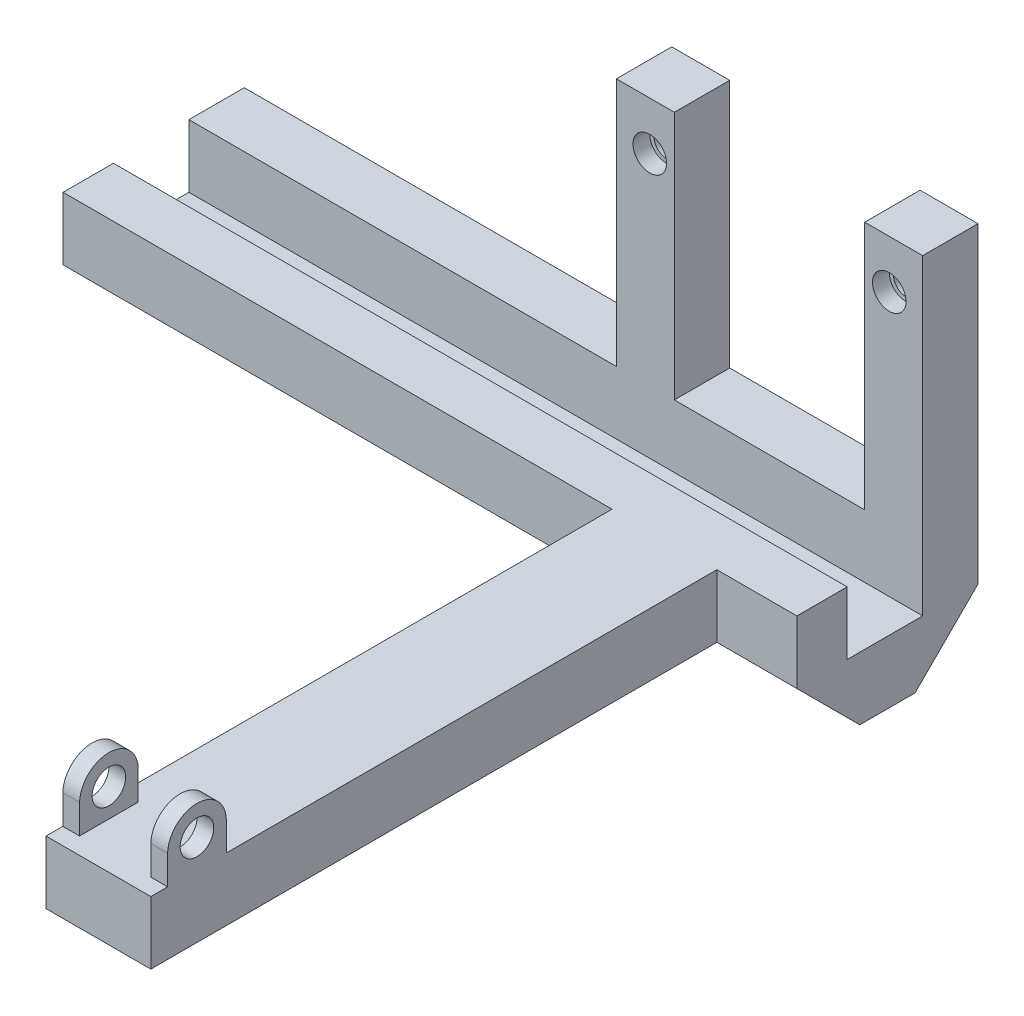
ISO-10303-21;
HEADER;
FILE_DESCRIPTION(('STEP AP214'),'2;1');
FILE_NAME('part.step','',(''),(''),'','','');
FILE_SCHEMA(('AUTOMOTIVE_DESIGN { 1 0 10303 214 1 1 1 1 }'));
ENDSEC;
DATA;
#1=APPLICATION_CONTEXT('core data for automotive mechanical design processes');
#2=APPLICATION_PROTOCOL_DEFINITION('international standard','automotive_design',2000,#1);
#3=PRODUCT_CONTEXT('',#1,'mechanical');
#4=PRODUCT('Part','Part','',(#3));
#5=PRODUCT_RELATED_PRODUCT_CATEGORY('part','',(#4));
#6=PRODUCT_DEFINITION_FORMATION('','',#4);
#7=PRODUCT_DEFINITION_CONTEXT('part definition',#1,'design');
#8=PRODUCT_DEFINITION('design','',#6,#7);
#9=PRODUCT_DEFINITION_SHAPE('','',#8);
#10=(LENGTH_UNIT() NAMED_UNIT(*) SI_UNIT(.MILLI.,.METRE.));
#11=(NAMED_UNIT(*) PLANE_ANGLE_UNIT() SI_UNIT($,.RADIAN.));
#12=(NAMED_UNIT(*) SI_UNIT($,.STERADIAN.) SOLID_ANGLE_UNIT());
#13=UNCERTAINTY_MEASURE_WITH_UNIT(LENGTH_MEASURE(1.E-05),#10,'distance_accuracy_value','');
#14=(GEOMETRIC_REPRESENTATION_CONTEXT(3) GLOBAL_UNCERTAINTY_ASSIGNED_CONTEXT((#13)) GLOBAL_UNIT_ASSIGNED_CONTEXT((#10,
#11,#12)) REPRESENTATION_CONTEXT('',''));
#15=CARTESIAN_POINT('',(0.,0.,0.));
#16=DIRECTION('',(0.,0.,1.));
#17=DIRECTION('',(1.,0.,0.));
#18=AXIS2_PLACEMENT_3D('',#15,#16,#17);
#19=CARTESIAN_POINT('',(-3.98,12.40971438,-8.80000000000001));
#20=DIRECTION('',(0.,0.,1.));
#21=DIRECTION('',(1.,0.,0.));
#22=AXIS2_PLACEMENT_3D('',#19,#20,#21);
#23=CYLINDRICAL_SURFACE('',#22,1.5);
#24=CARTESIAN_POINT('',(-3.98,12.40971438,8.4));
#25=DIRECTION('',(0.,0.,1.));
#26=DIRECTION('',(0.,-1.,0.));
#27=AXIS2_PLACEMENT_3D('',#24,#25,#26);
#28=CIRCLE('',#27,1.5);
#29=CARTESIAN_POINT('',(-3.98,10.90971438,8.4));
#30=VERTEX_POINT('',#29);
#31=EDGE_CURVE('E357',#30,#30,#28,.T.);
#32=ORIENTED_EDGE('',*,*,#31,.F.);
#33=EDGE_LOOP('',(#32));
#34=FACE_BOUND('',#33,.T.);
#35=CARTESIAN_POINT('',(-3.98,12.40971438,13.));
#36=DIRECTION('',(0.,0.,1.));
#37=DIRECTION('',(1.,0.,0.));
#38=AXIS2_PLACEMENT_3D('',#35,#36,#37);
#39=CIRCLE('',#38,1.5);
#40=CARTESIAN_POINT('',(-2.48,12.40971438,13.));
#41=VERTEX_POINT('',#40);
#42=EDGE_CURVE('E43',#41,#41,#39,.F.);
#43=ORIENTED_EDGE('',*,*,#42,.F.);
#44=EDGE_LOOP('',(#43));
#45=FACE_BOUND('',#44,.T.);
#46=ADVANCED_FACE('F39',(#34,#45),#23,.F.);
#47=CARTESIAN_POINT('',(-32.54,12.40971438,-8.80000000000001));
#48=DIRECTION('',(0.,0.,1.));
#49=DIRECTION('',(1.,0.,0.));
#50=AXIS2_PLACEMENT_3D('',#47,#48,#49);
#51=CYLINDRICAL_SURFACE('',#50,1.5);
#52=CARTESIAN_POINT('',(-32.54,12.40971438,8.4));
#53=DIRECTION('',(0.,0.,1.));
#54=DIRECTION('',(0.,-1.,0.));
#55=AXIS2_PLACEMENT_3D('',#52,#53,#54);
#56=CIRCLE('',#55,1.5);
#57=CARTESIAN_POINT('',(-32.54,10.90971438,8.4));
#58=VERTEX_POINT('',#57);
#59=EDGE_CURVE('E377',#58,#58,#56,.T.);
#60=ORIENTED_EDGE('',*,*,#59,.F.);
#61=EDGE_LOOP('',(#60));
#62=FACE_BOUND('',#61,.T.);
#63=CARTESIAN_POINT('',(-32.54,12.40971438,13.));
#64=DIRECTION('',(0.,0.,1.));
#65=DIRECTION('',(1.,0.,0.));
#66=AXIS2_PLACEMENT_3D('',#63,#64,#65);
#67=CIRCLE('',#66,1.5);
#68=CARTESIAN_POINT('',(-31.04,12.40971438,13.));
#69=VERTEX_POINT('',#68);
#70=EDGE_CURVE('E348',#69,#69,#67,.F.);
#71=ORIENTED_EDGE('',*,*,#70,.F.);
#72=EDGE_LOOP('',(#71));
#73=FACE_BOUND('',#72,.T.);
#74=ADVANCED_FACE('F695',(#62,#73),#51,.F.);
#75=CARTESIAN_POINT('',(-22.04,-11.56,-15.402));
#76=DIRECTION('',(-1.,0.,0.));
#77=DIRECTION('',(0.,-1.,0.));
#78=AXIS2_PLACEMENT_3D('',#75,#76,#77);
#79=PLANE('',#78);
#80=CARTESIAN_POINT('',(-22.04,-8.1939412358239,92.));
#81=DIRECTION('',(-1.,0.,0.));
#82=DIRECTION('',(0.,-1.,0.));
#83=AXIS2_PLACEMENT_3D('',#80,#81,#82);
#84=CIRCLE('',#83,2.);
#85=CARTESIAN_POINT('',(-22.04,-10.1939412358239,92.));
#86=VERTEX_POINT('',#85);
#87=EDGE_CURVE('E456',#86,#86,#84,.T.);
#88=ORIENTED_EDGE('',*,*,#87,.F.);
#89=EDGE_LOOP('',(#88));
#90=FACE_BOUND('',#89,.T.);
#91=CARTESIAN_POINT('',(-22.04,-8.1939412358239,92.));
#92=DIRECTION('',(-1.,0.,0.));
#93=DIRECTION('',(0.,-1.,0.));
#94=AXIS2_PLACEMENT_3D('',#91,#92,#93);
#95=CIRCLE('',#94,3.50192370515723);
#96=CARTESIAN_POINT('',(-22.04,-8.07788247164778,88.5));
#97=VERTEX_POINT('',#96);
#98=CARTESIAN_POINT('',(-22.04,-8.07788247164778,95.5));
#99=VERTEX_POINT('',#98);
#100=EDGE_CURVE('E57',#97,#99,#95,.F.);
#101=ORIENTED_EDGE('',*,*,#100,.F.);
#102=DIRECTION('',(0.,-1.,0.));
#103=VECTOR('',#102,1.);
#104=CARTESIAN_POINT('',(-22.04,-1.56000000000001,88.5));
#105=LINE('',#104,#103);
#106=CARTESIAN_POINT('',(-22.04,-11.56,88.5));
#107=VERTEX_POINT('',#106);
#108=EDGE_CURVE('E516',#97,#107,#105,.T.);
#109=ORIENTED_EDGE('',*,*,#108,.T.);
#110=DIRECTION('',(0.,0.,1.));
#111=VECTOR('',#110,1.);
#112=CARTESIAN_POINT('',(-22.04,-11.56,-15.402));
#113=LINE('',#112,#111);
#114=CARTESIAN_POINT('',(-22.04,-11.56,30.));
#115=VERTEX_POINT('',#114);
#116=EDGE_CURVE('E289',#115,#107,#113,.T.);
#117=ORIENTED_EDGE('',*,*,#116,.F.);
#118=DIRECTION('',(0.,-1.,0.));
#119=VECTOR('',#118,1.);
#120=CARTESIAN_POINT('',(-22.04,-11.56,30.));
#121=LINE('',#120,#119);
#122=CARTESIAN_POINT('',(-22.04,-19.06,30.));
#123=VERTEX_POINT('',#122);
#124=EDGE_CURVE('E279',#115,#123,#121,.T.);
#125=ORIENTED_EDGE('',*,*,#124,.T.);
#126=DIRECTION('',(0.,0.,-1.));
#127=VECTOR('',#126,1.);
#128=CARTESIAN_POINT('',(-22.04,-19.06,30.));
#129=LINE('',#128,#127);
#130=CARTESIAN_POINT('',(-22.04,-19.06,97.5));
#131=VERTEX_POINT('',#130);
#132=EDGE_CURVE('E546',#131,#123,#129,.T.);
#133=ORIENTED_EDGE('',*,*,#132,.F.);
#134=DIRECTION('',(0.,-1.,0.));
#135=VECTOR('',#134,1.);
#136=CARTESIAN_POINT('',(-22.04,-11.56,97.5));
#137=LINE('',#136,#135);
#138=CARTESIAN_POINT('',(-22.04,-11.56,97.5));
#139=VERTEX_POINT('',#138);
#140=EDGE_CURVE('E284',#139,#131,#137,.T.);
#141=ORIENTED_EDGE('',*,*,#140,.F.);
#142=CARTESIAN_POINT('',(-22.04,-11.56,95.5));
#143=VERTEX_POINT('',#142);
#144=EDGE_CURVE('E283',#143,#139,#113,.T.);
#145=ORIENTED_EDGE('',*,*,#144,.F.);
#146=DIRECTION('',(0.,-1.,0.));
#147=VECTOR('',#146,1.);
#148=CARTESIAN_POINT('',(-22.04,-1.56000000000001,95.5));
#149=LINE('',#148,#147);
#150=EDGE_CURVE('E525',#99,#143,#149,.T.);
#151=ORIENTED_EDGE('',*,*,#150,.F.);
#152=EDGE_LOOP('',(#101,#109,#117,#125,#133,#141,#145,#151));
#153=FACE_BOUND('',#152,.T.);
#154=ADVANCED_FACE('F595',(#90,#153),#79,.T.);
#155=CARTESIAN_POINT('',(-9.54,-11.56,30.));
#156=DIRECTION('',(-1.,0.,0.));
#157=DIRECTION('',(0.,-1.,0.));
#158=AXIS2_PLACEMENT_3D('',#155,#156,#157);
#159=PLANE('',#158);
#160=CARTESIAN_POINT('',(-9.54,-8.1939412358239,92.));
#161=DIRECTION('',(1.,0.,0.));
#162=DIRECTION('',(0.,1.,0.));
#163=AXIS2_PLACEMENT_3D('',#160,#161,#162);
#164=CIRCLE('',#163,2.);
#165=CARTESIAN_POINT('',(-9.54,-6.1939412358239,92.));
#166=VERTEX_POINT('',#165);
#167=EDGE_CURVE('E347',#166,#166,#164,.T.);
#168=ORIENTED_EDGE('',*,*,#167,.F.);
#169=EDGE_LOOP('',(#168));
#170=FACE_BOUND('',#169,.T.);
#171=DIRECTION('',(0.,-1.,0.));
#172=VECTOR('',#171,1.);
#173=CARTESIAN_POINT('',(-9.54,-1.56000000000001,88.5));
#174=LINE('',#173,#172);
#175=CARTESIAN_POINT('',(-9.54,-8.07788247164778,88.5));
#176=VERTEX_POINT('',#175);
#177=CARTESIAN_POINT('',(-9.54,-11.56,88.5));
#178=VERTEX_POINT('',#177);
#179=EDGE_CURVE('E501',#176,#178,#174,.T.);
#180=ORIENTED_EDGE('',*,*,#179,.F.);
#181=CARTESIAN_POINT('',(-9.54,-8.1939412358239,92.));
#182=DIRECTION('',(1.,0.,0.));
#183=DIRECTION('',(0.,1.,0.));
#184=AXIS2_PLACEMENT_3D('',#181,#182,#183);
#185=CIRCLE('',#184,3.50192370515723);
#186=CARTESIAN_POINT('',(-9.54,-8.07788247164778,95.5));
#187=VERTEX_POINT('',#186);
#188=EDGE_CURVE('E460',#187,#176,#185,.F.);
#189=ORIENTED_EDGE('',*,*,#188,.F.);
#190=DIRECTION('',(0.,-1.,0.));
#191=VECTOR('',#190,1.);
#192=CARTESIAN_POINT('',(-9.54,-1.56000000000001,95.5));
#193=LINE('',#192,#191);
#194=CARTESIAN_POINT('',(-9.54,-11.56,95.5));
#195=VERTEX_POINT('',#194);
#196=EDGE_CURVE('E492',#187,#195,#193,.T.);
#197=ORIENTED_EDGE('',*,*,#196,.T.);
#198=DIRECTION('',(0.,0.,1.));
#199=VECTOR('',#198,1.);
#200=CARTESIAN_POINT('',(-9.54,-11.56,30.));
#201=LINE('',#200,#199);
#202=CARTESIAN_POINT('',(-9.54,-11.56,97.5));
#203=VERTEX_POINT('',#202);
#204=EDGE_CURVE('E271',#195,#203,#201,.T.);
#205=ORIENTED_EDGE('',*,*,#204,.T.);
#206=DIRECTION('',(0.,-1.,0.));
#207=VECTOR('',#206,1.);
#208=CARTESIAN_POINT('',(-9.54,-11.56,97.5));
#209=LINE('',#208,#207);
#210=CARTESIAN_POINT('',(-9.54,-19.06,97.5));
#211=VERTEX_POINT('',#210);
#212=EDGE_CURVE('E266',#203,#211,#209,.T.);
#213=ORIENTED_EDGE('',*,*,#212,.T.);
#214=DIRECTION('',(0.,0.,-1.));
#215=VECTOR('',#214,1.);
#216=CARTESIAN_POINT('',(-9.54,-19.06,30.));
#217=LINE('',#216,#215);
#218=CARTESIAN_POINT('',(-9.54,-19.06,30.));
#219=VERTEX_POINT('',#218);
#220=EDGE_CURVE('E11',#211,#219,#217,.T.);
#221=ORIENTED_EDGE('',*,*,#220,.T.);
#222=DIRECTION('',(0.,-1.,0.));
#223=VECTOR('',#222,1.);
#224=CARTESIAN_POINT('',(-9.54,-11.56,30.));
#225=LINE('',#224,#223);
#226=CARTESIAN_POINT('',(-9.54,-11.56,30.));
#227=VERTEX_POINT('',#226);
#228=EDGE_CURVE('E267',#227,#219,#225,.T.);
#229=ORIENTED_EDGE('',*,*,#228,.F.);
#230=EDGE_CURVE('E275',#227,#178,#201,.T.);
#231=ORIENTED_EDGE('',*,*,#230,.T.);
#232=EDGE_LOOP('',(#180,#189,#197,#205,#213,#221,#229,#231));
#233=FACE_BOUND('',#232,.T.);
#234=ADVANCED_FACE('F604',(#170,#233),#159,.F.);
#235=CARTESIAN_POINT('',(-20.04,-1.56000000000001,95.5));
#236=DIRECTION('',(-1.,0.,0.));
#237=DIRECTION('',(0.,0.,1.));
#238=AXIS2_PLACEMENT_3D('',#235,#236,#237);
#239=PLANE('',#238);
#240=CARTESIAN_POINT('',(-20.04,-8.1939412358239,92.));
#241=DIRECTION('',(-1.,0.,0.));
#242=DIRECTION('',(0.,0.,1.));
#243=AXIS2_PLACEMENT_3D('',#240,#241,#242);
#244=CIRCLE('',#243,2.);
#245=CARTESIAN_POINT('',(-20.04,-8.1939412358239,94.));
#246=VERTEX_POINT('',#245);
#247=EDGE_CURVE('E346',#246,#246,#244,.T.);
#248=ORIENTED_EDGE('',*,*,#247,.T.);
#249=EDGE_LOOP('',(#248));
#250=FACE_BOUND('',#249,.T.);
#251=DIRECTION('',(0.,-1.,0.));
#252=VECTOR('',#251,1.);
#253=CARTESIAN_POINT('',(-20.04,-1.56000000000001,88.5));
#254=LINE('',#253,#252);
#255=CARTESIAN_POINT('',(-20.04,-8.07788247164778,88.5));
#256=VERTEX_POINT('',#255);
#257=CARTESIAN_POINT('',(-20.04,-11.56,88.5));
#258=VERTEX_POINT('',#257);
#259=EDGE_CURVE('E519',#256,#258,#254,.T.);
#260=ORIENTED_EDGE('',*,*,#259,.F.);
#261=CARTESIAN_POINT('',(-20.04,-8.1939412358239,92.));
#262=DIRECTION('',(-1.,0.,0.));
#263=DIRECTION('',(0.,0.,1.));
#264=AXIS2_PLACEMENT_3D('',#261,#262,#263);
#265=CIRCLE('',#264,3.50192370515723);
#266=CARTESIAN_POINT('',(-20.04,-8.07788247164778,95.5));
#267=VERTEX_POINT('',#266);
#268=EDGE_CURVE('E474',#256,#267,#265,.F.);
#269=ORIENTED_EDGE('',*,*,#268,.T.);
#270=DIRECTION('',(0.,-1.,0.));
#271=VECTOR('',#270,1.);
#272=CARTESIAN_POINT('',(-20.04,-1.56000000000001,95.5));
#273=LINE('',#272,#271);
#274=CARTESIAN_POINT('',(-20.04,-11.56,95.5));
#275=VERTEX_POINT('',#274);
#276=EDGE_CURVE('E522',#267,#275,#273,.T.);
#277=ORIENTED_EDGE('',*,*,#276,.T.);
#278=DIRECTION('',(0.,0.,-1.));
#279=VECTOR('',#278,1.);
#280=CARTESIAN_POINT('',(-20.04,-11.56,95.5));
#281=LINE('',#280,#279);
#282=EDGE_CURVE('E508',#275,#258,#281,.T.);
#283=ORIENTED_EDGE('',*,*,#282,.T.);
#284=EDGE_LOOP('',(#260,#269,#277,#283));
#285=FACE_BOUND('',#284,.T.);
#286=ADVANCED_FACE('F581',(#250,#285),#239,.F.);
#287=CARTESIAN_POINT('',(-11.54,-1.56000000000001,95.5));
#288=DIRECTION('',(1.,0.,0.));
#289=DIRECTION('',(0.,0.,-1.));
#290=AXIS2_PLACEMENT_3D('',#287,#288,#289);
#291=PLANE('',#290);
#292=CARTESIAN_POINT('',(-11.54,-8.1939412358239,92.));
#293=DIRECTION('',(1.,0.,0.));
#294=DIRECTION('',(0.,0.,-1.));
#295=AXIS2_PLACEMENT_3D('',#292,#293,#294);
#296=CIRCLE('',#295,2.);
#297=CARTESIAN_POINT('',(-11.54,-8.1939412358239,90.));
#298=VERTEX_POINT('',#297);
#299=EDGE_CURVE('E343',#298,#298,#296,.T.);
#300=ORIENTED_EDGE('',*,*,#299,.T.);
#301=EDGE_LOOP('',(#300));
#302=FACE_BOUND('',#301,.T.);
#303=DIRECTION('',(0.,-1.,0.));
#304=VECTOR('',#303,1.);
#305=CARTESIAN_POINT('',(-11.54,-1.56000000000001,95.5));
#306=LINE('',#305,#304);
#307=CARTESIAN_POINT('',(-11.54,-8.07788247164778,95.5));
#308=VERTEX_POINT('',#307);
#309=CARTESIAN_POINT('',(-11.54,-11.56,95.5));
#310=VERTEX_POINT('',#309);
#311=EDGE_CURVE('E495',#308,#310,#306,.T.);
#312=ORIENTED_EDGE('',*,*,#311,.F.);
#313=CARTESIAN_POINT('',(-11.54,-8.1939412358239,92.));
#314=DIRECTION('',(1.,0.,0.));
#315=DIRECTION('',(0.,0.,-1.));
#316=AXIS2_PLACEMENT_3D('',#313,#314,#315);
#317=CIRCLE('',#316,3.50192370515723);
#318=CARTESIAN_POINT('',(-11.54,-8.07788247164778,88.5));
#319=VERTEX_POINT('',#318);
#320=EDGE_CURVE('E65',#308,#319,#317,.F.);
#321=ORIENTED_EDGE('',*,*,#320,.T.);
#322=DIRECTION('',(0.,-1.,0.));
#323=VECTOR('',#322,1.);
#324=CARTESIAN_POINT('',(-11.54,-1.56000000000001,88.5));
#325=LINE('',#324,#323);
#326=CARTESIAN_POINT('',(-11.54,-11.56,88.5));
#327=VERTEX_POINT('',#326);
#328=EDGE_CURVE('E498',#319,#327,#325,.T.);
#329=ORIENTED_EDGE('',*,*,#328,.T.);
#330=DIRECTION('',(0.,0.,1.));
#331=VECTOR('',#330,1.);
#332=CARTESIAN_POINT('',(-11.54,-11.56,95.5));
#333=LINE('',#332,#331);
#334=EDGE_CURVE('E484',#327,#310,#333,.T.);
#335=ORIENTED_EDGE('',*,*,#334,.T.);
#336=EDGE_LOOP('',(#312,#321,#329,#335));
#337=FACE_BOUND('',#336,.T.);
#338=ADVANCED_FACE('F682',(#302,#337),#291,.F.);
#339=CARTESIAN_POINT('',(-22.04,-1.56000000000001,88.5));
#340=DIRECTION('',(0.,0.,1.));
#341=DIRECTION('',(1.,0.,0.));
#342=AXIS2_PLACEMENT_3D('',#339,#340,#341);
#343=PLANE('',#342);
#344=ORIENTED_EDGE('',*,*,#108,.F.);
#345=DIRECTION('',(1.,0.,0.));
#346=VECTOR('',#345,1.);
#347=CARTESIAN_POINT('',(-69.999860538626,-8.07788247164779,88.5));
#348=LINE('',#347,#346);
#349=EDGE_CURVE('E468',#97,#256,#348,.T.);
#350=ORIENTED_EDGE('',*,*,#349,.T.);
#351=ORIENTED_EDGE('',*,*,#259,.T.);
#352=DIRECTION('',(-1.,0.,0.));
#353=VECTOR('',#352,1.);
#354=CARTESIAN_POINT('',(-22.04,-11.56,88.5));
#355=LINE('',#354,#353);
#356=EDGE_CURVE('E512',#258,#107,#355,.T.);
#357=ORIENTED_EDGE('',*,*,#356,.T.);
#358=EDGE_LOOP('',(#344,#350,#351,#357));
#359=FACE_BOUND('',#358,.T.);
#360=ADVANCED_FACE('F593',(#359),#343,.F.);
#361=CARTESIAN_POINT('',(-9.54,-1.56000000000001,88.5));
#362=DIRECTION('',(0.,0.,1.));
#363=DIRECTION('',(1.,0.,0.));
#364=AXIS2_PLACEMENT_3D('',#361,#362,#363);
#365=PLANE('',#364);
#366=ORIENTED_EDGE('',*,*,#328,.F.);
#367=EDGE_CURVE('E464',#319,#176,#348,.T.);
#368=ORIENTED_EDGE('',*,*,#367,.T.);
#369=ORIENTED_EDGE('',*,*,#179,.T.);
#370=DIRECTION('',(-1.,0.,0.));
#371=VECTOR('',#370,1.);
#372=CARTESIAN_POINT('',(-9.54,-11.56,88.5));
#373=LINE('',#372,#371);
#374=EDGE_CURVE('E480',#178,#327,#373,.T.);
#375=ORIENTED_EDGE('',*,*,#374,.T.);
#376=EDGE_LOOP('',(#366,#368,#369,#375));
#377=FACE_BOUND('',#376,.T.);
#378=ADVANCED_FACE('F678',(#377),#365,.F.);
#379=CARTESIAN_POINT('',(0.,-11.56,0.));
#380=DIRECTION('',(0.,-1.,0.));
#381=DIRECTION('',(0.,0.,-1.));
#382=AXIS2_PLACEMENT_3D('',#379,#380,#381);
#383=PLANE('',#382);
#384=ORIENTED_EDGE('',*,*,#374,.F.);
#385=ORIENTED_EDGE('',*,*,#230,.F.);
#386=DIRECTION('',(1.,0.,0.));
#387=VECTOR('',#386,1.);
#388=CARTESIAN_POINT('',(-71.9838605386259,-11.56,30.));
#389=LINE('',#388,#387);
#390=CARTESIAN_POINT('',(0.,-11.56,30.));
#391=VERTEX_POINT('',#390);
#392=EDGE_CURVE('E314',#227,#391,#389,.T.);
#393=ORIENTED_EDGE('',*,*,#392,.T.);
#394=DIRECTION('',(0.,0.,-1.));
#395=VECTOR('',#394,1.);
#396=CARTESIAN_POINT('',(0.,-11.56,30.));
#397=LINE('',#396,#395);
#398=CARTESIAN_POINT('',(0.,-11.56,24.));
#399=VERTEX_POINT('',#398);
#400=EDGE_CURVE('E319',#391,#399,#397,.T.);
#401=ORIENTED_EDGE('',*,*,#400,.T.);
#402=DIRECTION('',(1.,0.,0.));
#403=VECTOR('',#402,1.);
#404=CARTESIAN_POINT('',(-69.999860538626,-11.56,24.));
#405=LINE('',#404,#403);
#406=CARTESIAN_POINT('',(-87.499860538626,-11.56,24.));
#407=VERTEX_POINT('',#406);
#408=EDGE_CURVE('E296',#407,#399,#405,.T.);
#409=ORIENTED_EDGE('',*,*,#408,.F.);
#410=DIRECTION('',(0.,0.,-1.));
#411=VECTOR('',#410,1.);
#412=CARTESIAN_POINT('',(-87.499860538626,-11.56,30.));
#413=LINE('',#412,#411);
#414=CARTESIAN_POINT('',(-87.499860538626,-11.56,30.));
#415=VERTEX_POINT('',#414);
#416=EDGE_CURVE('E434',#415,#407,#413,.T.);
#417=ORIENTED_EDGE('',*,*,#416,.F.);
#418=EDGE_CURVE('E315',#415,#115,#389,.T.);
#419=ORIENTED_EDGE('',*,*,#418,.T.);
#420=ORIENTED_EDGE('',*,*,#116,.T.);
#421=ORIENTED_EDGE('',*,*,#356,.F.);
#422=ORIENTED_EDGE('',*,*,#282,.F.);
#423=DIRECTION('',(1.,0.,0.));
#424=VECTOR('',#423,1.);
#425=CARTESIAN_POINT('',(-22.04,-11.56,95.5));
#426=LINE('',#425,#424);
#427=EDGE_CURVE('E504',#143,#275,#426,.T.);
#428=ORIENTED_EDGE('',*,*,#427,.F.);
#429=ORIENTED_EDGE('',*,*,#144,.T.);
#430=DIRECTION('',(-1.,0.,0.));
#431=VECTOR('',#430,1.);
#432=CARTESIAN_POINT('',(-7.54,-11.56,97.5));
#433=LINE('',#432,#431);
#434=EDGE_CURVE('E301',#203,#139,#433,.T.);
#435=ORIENTED_EDGE('',*,*,#434,.F.);
#436=ORIENTED_EDGE('',*,*,#204,.F.);
#437=DIRECTION('',(1.,0.,0.));
#438=VECTOR('',#437,1.);
#439=CARTESIAN_POINT('',(-9.54,-11.56,95.5));
#440=LINE('',#439,#438);
#441=EDGE_CURVE('E488',#310,#195,#440,.T.);
#442=ORIENTED_EDGE('',*,*,#441,.F.);
#443=ORIENTED_EDGE('',*,*,#334,.F.);
#444=EDGE_LOOP('',(#384,#385,#393,#401,#409,#417,#419,#420,#421,#422,#428,#429,#435,#436,#442,#443));
#445=FACE_BOUND('',#444,.T.);
#446=ADVANCED_FACE('F588',(#445),#383,.F.);
#447=CARTESIAN_POINT('',(0.,0.,30.));
#448=DIRECTION('',(0.,0.,-1.));
#449=DIRECTION('',(-1.,0.,0.));
#450=AXIS2_PLACEMENT_3D('',#447,#448,#449);
#451=PLANE('',#450);
#452=ORIENTED_EDGE('',*,*,#418,.F.);
#453=DIRECTION('',(0.,1.,0.));
#454=VECTOR('',#453,1.);
#455=CARTESIAN_POINT('',(-87.499860538626,-19.0600000000001,30.));
#456=LINE('',#455,#454);
#457=CARTESIAN_POINT('',(-87.499860538626,-19.0600000000001,30.));
#458=VERTEX_POINT('',#457);
#459=EDGE_CURVE('E430',#458,#415,#456,.T.);
#460=ORIENTED_EDGE('',*,*,#459,.F.);
#461=DIRECTION('',(-1.,0.,0.));
#462=VECTOR('',#461,1.);
#463=CARTESIAN_POINT('',(0.,-19.06,30.));
#464=LINE('',#463,#462);
#465=EDGE_CURVE('E532',#123,#458,#464,.T.);
#466=ORIENTED_EDGE('',*,*,#465,.F.);
#467=ORIENTED_EDGE('',*,*,#124,.F.);
#468=EDGE_LOOP('',(#452,#460,#466,#467));
#469=FACE_BOUND('',#468,.T.);
#470=ADVANCED_FACE('F617',(#469),#451,.F.);
#471=CARTESIAN_POINT('',(-71.9838605386259,-26.56,8.4));
#472=DIRECTION('',(0.,0.,1.));
#473=DIRECTION('',(0.,-1.,0.));
#474=AXIS2_PLACEMENT_3D('',#471,#472,#473);
#475=PLANE('',#474);
#476=ORIENTED_EDGE('',*,*,#59,.T.);
#477=EDGE_LOOP('',(#476));
#478=FACE_BOUND('',#477,.T.);
#479=DIRECTION('',(0.,-1.,0.));
#480=VECTOR('',#479,1.);
#481=CARTESIAN_POINT('',(-29.61,-26.56,8.4));
#482=LINE('',#481,#480);
#483=CARTESIAN_POINT('',(-29.61,18.14971438,8.4));
#484=VERTEX_POINT('',#483);
#485=CARTESIAN_POINT('',(-29.61,-11.56,8.4));
#486=VERTEX_POINT('',#485);
#487=EDGE_CURVE('E243',#484,#486,#482,.T.);
#488=ORIENTED_EDGE('',*,*,#487,.T.);
#489=DIRECTION('',(1.,0.,0.));
#490=VECTOR('',#489,1.);
#491=CARTESIAN_POINT('',(-29.61,-11.56,8.4));
#492=LINE('',#491,#490);
#493=CARTESIAN_POINT('',(-6.91,-11.56,8.4));
#494=VERTEX_POINT('',#493);
#495=EDGE_CURVE('E227',#486,#494,#492,.T.);
#496=ORIENTED_EDGE('',*,*,#495,.T.);
#497=DIRECTION('',(0.,-1.,0.));
#498=VECTOR('',#497,1.);
#499=CARTESIAN_POINT('',(-6.91,0.,8.4));
#500=LINE('',#499,#498);
#501=CARTESIAN_POINT('',(-6.91,18.14971438,8.4));
#502=VERTEX_POINT('',#501);
#503=EDGE_CURVE('E258',#502,#494,#500,.T.);
#504=ORIENTED_EDGE('',*,*,#503,.F.);
#505=DIRECTION('',(-1.,0.,0.));
#506=VECTOR('',#505,1.);
#507=CARTESIAN_POINT('',(-6.91,18.14971438,8.4));
#508=LINE('',#507,#506);
#509=CARTESIAN_POINT('',(0.,18.14971438,8.4));
#510=VERTEX_POINT('',#509);
#511=EDGE_CURVE('E406',#510,#502,#508,.T.);
#512=ORIENTED_EDGE('',*,*,#511,.F.);
#513=DIRECTION('',(0.,-1.,0.));
#514=VECTOR('',#513,1.);
#515=CARTESIAN_POINT('',(0.,-26.56,8.4));
#516=LINE('',#515,#514);
#517=CARTESIAN_POINT('',(0.,-19.06,8.4));
#518=VERTEX_POINT('',#517);
#519=EDGE_CURVE('E307',#510,#518,#516,.T.);
#520=ORIENTED_EDGE('',*,*,#519,.T.);
#521=DIRECTION('',(-1.,0.,0.));
#522=VECTOR('',#521,1.);
#523=CARTESIAN_POINT('',(0.,-19.06,8.4));
#524=LINE('',#523,#522);
#525=CARTESIAN_POINT('',(-87.499860538626,-19.06,8.4));
#526=VERTEX_POINT('',#525);
#527=EDGE_CURVE('E554',#518,#526,#524,.T.);
#528=ORIENTED_EDGE('',*,*,#527,.T.);
#529=DIRECTION('',(0.,-1.,0.));
#530=VECTOR('',#529,1.);
#531=CARTESIAN_POINT('',(-87.499860538626,-11.56,8.4));
#532=LINE('',#531,#530);
#533=CARTESIAN_POINT('',(-87.499860538626,-11.56,8.4));
#534=VERTEX_POINT('',#533);
#535=EDGE_CURVE('E414',#534,#526,#532,.T.);
#536=ORIENTED_EDGE('',*,*,#535,.F.);
#537=DIRECTION('',(-1.,0.,0.));
#538=VECTOR('',#537,1.);
#539=CARTESIAN_POINT('',(-71.9838605386259,-11.56,8.4));
#540=LINE('',#539,#538);
#541=CARTESIAN_POINT('',(-36.52,-11.56,8.4));
#542=VERTEX_POINT('',#541);
#543=EDGE_CURVE('E311',#542,#534,#540,.T.);
#544=ORIENTED_EDGE('',*,*,#543,.F.);
#545=DIRECTION('',(0.,-1.,0.));
#546=VECTOR('',#545,1.);
#547=CARTESIAN_POINT('',(-36.52,0.,8.4));
#548=LINE('',#547,#546);
#549=CARTESIAN_POINT('',(-36.52,18.14971438,8.4));
#550=VERTEX_POINT('',#549);
#551=EDGE_CURVE('E560',#550,#542,#548,.T.);
#552=ORIENTED_EDGE('',*,*,#551,.F.);
#553=DIRECTION('',(-1.,0.,0.));
#554=VECTOR('',#553,1.);
#555=CARTESIAN_POINT('',(-29.61,18.14971438,8.4));
#556=LINE('',#555,#554);
#557=EDGE_CURVE('E251',#484,#550,#556,.T.);
#558=ORIENTED_EDGE('',*,*,#557,.F.);
#559=EDGE_LOOP('',(#488,#496,#504,#512,#520,#528,#536,#544,#552,#558));
#560=FACE_BOUND('',#559,.T.);
#561=ORIENTED_EDGE('',*,*,#31,.T.);
#562=EDGE_LOOP('',(#561));
#563=FACE_BOUND('',#562,.T.);
#564=ADVANCED_FACE('F248',(#478,#560,#563),#475,.F.);
#565=ORIENTED_EDGE('',*,*,#228,.T.);
#566=CARTESIAN_POINT('',(0.,-19.06,30.));
#567=VERTEX_POINT('',#566);
#568=EDGE_CURVE('E537',#567,#219,#464,.T.);
#569=ORIENTED_EDGE('',*,*,#568,.F.);
#570=DIRECTION('',(0.,1.,0.));
#571=VECTOR('',#570,1.);
#572=CARTESIAN_POINT('',(0.,-26.56,30.));
#573=LINE('',#572,#571);
#574=EDGE_CURVE('E324',#567,#391,#573,.T.);
#575=ORIENTED_EDGE('',*,*,#574,.T.);
#576=ORIENTED_EDGE('',*,*,#392,.F.);
#577=EDGE_LOOP('',(#565,#569,#575,#576));
#578=FACE_BOUND('',#577,.T.);
#579=ADVANCED_FACE('F671',(#578),#451,.F.);
#580=CARTESIAN_POINT('',(-37.61,-11.56,15.));
#581=DIRECTION('',(0.,-1.,0.));
#582=DIRECTION('',(0.,0.,-1.));
#583=AXIS2_PLACEMENT_3D('',#580,#581,#582);
#584=PLANE('',#583);
#585=DIRECTION('',(0.,0.,1.));
#586=VECTOR('',#585,1.);
#587=CARTESIAN_POINT('',(-6.91,-11.56,8.4));
#588=LINE('',#587,#586);
#589=CARTESIAN_POINT('',(-6.91,-11.56,15.));
#590=VERTEX_POINT('',#589);
#591=EDGE_CURVE('E233',#494,#590,#588,.T.);
#592=ORIENTED_EDGE('',*,*,#591,.F.);
#593=ORIENTED_EDGE('',*,*,#495,.F.);
#594=DIRECTION('',(0.,0.,1.));
#595=VECTOR('',#594,1.);
#596=CARTESIAN_POINT('',(-29.61,-11.56,-15.4));
#597=LINE('',#596,#595);
#598=CARTESIAN_POINT('',(-29.61,-11.56,15.));
#599=VERTEX_POINT('',#598);
#600=EDGE_CURVE('E230',#486,#599,#597,.T.);
#601=ORIENTED_EDGE('',*,*,#600,.T.);
#602=DIRECTION('',(-1.,0.,0.));
#603=VECTOR('',#602,1.);
#604=CARTESIAN_POINT('',(-37.61,-11.56,15.));
#605=LINE('',#604,#603);
#606=EDGE_CURVE('E332',#590,#599,#605,.T.);
#607=ORIENTED_EDGE('',*,*,#606,.F.);
#608=EDGE_LOOP('',(#592,#593,#601,#607));
#609=FACE_BOUND('',#608,.T.);
#610=ADVANCED_FACE('F229',(#609),#584,.F.);
#611=CARTESIAN_POINT('',(-71.9838605386259,-19.06,30.));
#612=DIRECTION('',(0.,-1.,0.));
#613=DIRECTION('',(0.,0.,-1.));
#614=AXIS2_PLACEMENT_3D('',#611,#612,#613);
#615=PLANE('',#614);
#616=DIRECTION('',(-1.,0.,0.));
#617=VECTOR('',#616,1.);
#618=CARTESIAN_POINT('',(-71.9838605386259,-19.06,15.));
#619=LINE('',#618,#617);
#620=CARTESIAN_POINT('',(0.,-19.06,15.));
#621=VERTEX_POINT('',#620);
#622=CARTESIAN_POINT('',(-87.499860538626,-19.06,15.));
#623=VERTEX_POINT('',#622);
#624=EDGE_CURVE('E323',#621,#623,#619,.T.);
#625=ORIENTED_EDGE('',*,*,#624,.T.);
#626=DIRECTION('',(0.,0.,-1.));
#627=VECTOR('',#626,1.);
#628=CARTESIAN_POINT('',(-87.499860538626,-19.06,24.));
#629=LINE('',#628,#627);
#630=CARTESIAN_POINT('',(-87.499860538626,-19.06,24.));
#631=VERTEX_POINT('',#630);
#632=EDGE_CURVE('E442',#631,#623,#629,.T.);
#633=ORIENTED_EDGE('',*,*,#632,.F.);
#634=DIRECTION('',(1.,0.,0.));
#635=VECTOR('',#634,1.);
#636=CARTESIAN_POINT('',(-69.999860538626,-19.06,24.));
#637=LINE('',#636,#635);
#638=CARTESIAN_POINT('',(0.,-19.06,24.));
#639=VERTEX_POINT('',#638);
#640=EDGE_CURVE('E297',#631,#639,#637,.T.);
#641=ORIENTED_EDGE('',*,*,#640,.T.);
#642=DIRECTION('',(0.,0.,-1.));
#643=VECTOR('',#642,1.);
#644=CARTESIAN_POINT('',(0.,-19.06,30.));
#645=LINE('',#644,#643);
#646=EDGE_CURVE('E327',#639,#621,#645,.T.);
#647=ORIENTED_EDGE('',*,*,#646,.T.);
#648=EDGE_LOOP('',(#625,#633,#641,#647));
#649=FACE_BOUND('',#648,.T.);
#650=ADVANCED_FACE('F628',(#649),#615,.F.);
#651=CARTESIAN_POINT('',(0.,0.,15.));
#652=DIRECTION('',(0.,0.,-1.));
#653=DIRECTION('',(-1.,0.,0.));
#654=AXIS2_PLACEMENT_3D('',#651,#652,#653);
#655=PLANE('',#654);
#656=CARTESIAN_POINT('',(-32.54,12.40971438,15.));
#657=DIRECTION('',(0.,0.,1.));
#658=DIRECTION('',(1.,0.,0.));
#659=AXIS2_PLACEMENT_3D('',#656,#657,#658);
#660=CIRCLE('',#659,2.);
#661=CARTESIAN_POINT('',(-30.54,12.40971438,15.));
#662=VERTEX_POINT('',#661);
#663=EDGE_CURVE('E359',#662,#662,#660,.T.);
#664=ORIENTED_EDGE('',*,*,#663,.F.);
#665=EDGE_LOOP('',(#664));
#666=FACE_BOUND('',#665,.T.);
#667=CARTESIAN_POINT('',(-3.98,12.40971438,15.));
#668=DIRECTION('',(0.,0.,1.));
#669=DIRECTION('',(1.,0.,0.));
#670=AXIS2_PLACEMENT_3D('',#667,#668,#669);
#671=CIRCLE('',#670,2.);
#672=CARTESIAN_POINT('',(-1.98,12.40971438,15.));
#673=VERTEX_POINT('',#672);
#674=EDGE_CURVE('E238',#673,#673,#671,.T.);
#675=ORIENTED_EDGE('',*,*,#674,.F.);
#676=EDGE_LOOP('',(#675));
#677=FACE_BOUND('',#676,.T.);
#678=DIRECTION('',(0.,-1.,0.));
#679=VECTOR('',#678,1.);
#680=CARTESIAN_POINT('',(-36.52,0.,15.));
#681=LINE('',#680,#679);
#682=CARTESIAN_POINT('',(-36.52,18.14971438,15.));
#683=VERTEX_POINT('',#682);
#684=CARTESIAN_POINT('',(-36.52,-11.56,15.));
#685=VERTEX_POINT('',#684);
#686=EDGE_CURVE('E559',#683,#685,#681,.T.);
#687=ORIENTED_EDGE('',*,*,#686,.T.);
#688=DIRECTION('',(-1.,0.,0.));
#689=VECTOR('',#688,1.);
#690=CARTESIAN_POINT('',(-71.9838605386259,-11.56,15.));
#691=LINE('',#690,#689);
#692=CARTESIAN_POINT('',(-87.499860538626,-11.56,15.));
#693=VERTEX_POINT('',#692);
#694=EDGE_CURVE('E335',#685,#693,#691,.T.);
#695=ORIENTED_EDGE('',*,*,#694,.T.);
#696=DIRECTION('',(0.,1.,0.));
#697=VECTOR('',#696,1.);
#698=CARTESIAN_POINT('',(-87.499860538626,-19.06,15.));
#699=LINE('',#698,#697);
#700=EDGE_CURVE('E446',#623,#693,#699,.T.);
#701=ORIENTED_EDGE('',*,*,#700,.F.);
#702=ORIENTED_EDGE('',*,*,#624,.F.);
#703=DIRECTION('',(0.,1.,0.));
#704=VECTOR('',#703,1.);
#705=CARTESIAN_POINT('',(0.,0.,15.));
#706=LINE('',#705,#704);
#707=CARTESIAN_POINT('',(0.,18.14971438,15.));
#708=VERTEX_POINT('',#707);
#709=EDGE_CURVE('E338',#621,#708,#706,.T.);
#710=ORIENTED_EDGE('',*,*,#709,.T.);
#711=DIRECTION('',(1.,0.,0.));
#712=VECTOR('',#711,1.);
#713=CARTESIAN_POINT('',(-6.91,18.14971438,15.));
#714=LINE('',#713,#712);
#715=CARTESIAN_POINT('',(-6.91,18.14971438,15.));
#716=VERTEX_POINT('',#715);
#717=EDGE_CURVE('E398',#716,#708,#714,.T.);
#718=ORIENTED_EDGE('',*,*,#717,.F.);
#719=DIRECTION('',(0.,-1.,0.));
#720=VECTOR('',#719,1.);
#721=CARTESIAN_POINT('',(-6.91,0.,15.));
#722=LINE('',#721,#720);
#723=EDGE_CURVE('E254',#716,#590,#722,.T.);
#724=ORIENTED_EDGE('',*,*,#723,.T.);
#725=ORIENTED_EDGE('',*,*,#606,.T.);
#726=DIRECTION('',(0.,-1.,0.));
#727=VECTOR('',#726,1.);
#728=CARTESIAN_POINT('',(-29.61,0.,15.));
#729=LINE('',#728,#727);
#730=CARTESIAN_POINT('',(-29.61,18.14971438,15.));
#731=VERTEX_POINT('',#730);
#732=EDGE_CURVE('E245',#731,#599,#729,.T.);
#733=ORIENTED_EDGE('',*,*,#732,.F.);
#734=DIRECTION('',(1.,0.,0.));
#735=VECTOR('',#734,1.);
#736=CARTESIAN_POINT('',(-29.61,18.14971438,15.));
#737=LINE('',#736,#735);
#738=EDGE_CURVE('E390',#683,#731,#737,.T.);
#739=ORIENTED_EDGE('',*,*,#738,.F.);
#740=EDGE_LOOP('',(#687,#695,#701,#702,#710,#718,#724,#725,#733,#739));
#741=FACE_BOUND('',#740,.T.);
#742=ADVANCED_FACE('F633',(#666,#677,#741),#655,.F.);
#743=CARTESIAN_POINT('',(0.,-26.56,15.));
#744=DIRECTION('',(0.,1.,0.));
#745=DIRECTION('',(-1.,0.,0.));
#746=AXIS2_PLACEMENT_3D('',#743,#744,#745);
#747=PLANE('',#746);
#748=DIRECTION('',(0.,0.,-1.));
#749=VECTOR('',#748,1.);
#750=CARTESIAN_POINT('',(0.,-26.56,15.));
#751=LINE('',#750,#749);
#752=CARTESIAN_POINT('',(0.,-26.56,22.5000000000002));
#753=VERTEX_POINT('',#752);
#754=CARTESIAN_POINT('',(0.,-26.56,15.9000000000002));
#755=VERTEX_POINT('',#754);
#756=EDGE_CURVE('E49',#753,#755,#751,.T.);
#757=ORIENTED_EDGE('',*,*,#756,.F.);
#758=DIRECTION('',(-1.,0.,0.));
#759=VECTOR('',#758,1.);
#760=CARTESIAN_POINT('',(0.,-26.56,22.5000000000002));
#761=LINE('',#760,#759);
#762=CARTESIAN_POINT('',(-87.499860538626,-26.56,22.5000000000002));
#763=VERTEX_POINT('',#762);
#764=EDGE_CURVE('E533',#753,#763,#761,.T.);
#765=ORIENTED_EDGE('',*,*,#764,.T.);
#766=DIRECTION('',(0.,0.,1.));
#767=VECTOR('',#766,1.);
#768=CARTESIAN_POINT('',(-87.499860538626,-26.56,15.9000000000002));
#769=LINE('',#768,#767);
#770=CARTESIAN_POINT('',(-87.499860538626,-26.56,15.9000000000002));
#771=VERTEX_POINT('',#770);
#772=EDGE_CURVE('E422',#771,#763,#769,.T.);
#773=ORIENTED_EDGE('',*,*,#772,.F.);
#774=DIRECTION('',(-1.,0.,0.));
#775=VECTOR('',#774,1.);
#776=CARTESIAN_POINT('',(0.,-26.56,15.9000000000002));
#777=LINE('',#776,#775);
#778=EDGE_CURVE('E543',#755,#771,#777,.T.);
#779=ORIENTED_EDGE('',*,*,#778,.F.);
#780=EDGE_LOOP('',(#757,#765,#773,#779));
#781=FACE_BOUND('',#780,.T.);
#782=ADVANCED_FACE('F663',(#781),#747,.F.);
#783=ORIENTED_EDGE('',*,*,#694,.F.);
#784=DIRECTION('',(0.,0.,1.));
#785=VECTOR('',#784,1.);
#786=CARTESIAN_POINT('',(-36.52,-11.56,8.4));
#787=LINE('',#786,#785);
#788=EDGE_CURVE('E564',#542,#685,#787,.T.);
#789=ORIENTED_EDGE('',*,*,#788,.F.);
#790=ORIENTED_EDGE('',*,*,#543,.T.);
#791=DIRECTION('',(0.,0.,-1.));
#792=VECTOR('',#791,1.);
#793=CARTESIAN_POINT('',(-87.499860538626,-11.56,15.));
#794=LINE('',#793,#792);
#795=EDGE_CURVE('E410',#693,#534,#794,.T.);
#796=ORIENTED_EDGE('',*,*,#795,.F.);
#797=EDGE_LOOP('',(#783,#789,#790,#796));
#798=FACE_BOUND('',#797,.T.);
#799=ADVANCED_FACE('F41',(#798),#584,.F.);
#800=CARTESIAN_POINT('',(0.,0.,15.));
#801=DIRECTION('',(-1.,0.,0.));
#802=DIRECTION('',(0.,-1.,0.));
#803=AXIS2_PLACEMENT_3D('',#800,#801,#802);
#804=PLANE('',#803);
#805=ORIENTED_EDGE('',*,*,#574,.F.);
#806=DIRECTION('',(0.,-0.707106781186553,-0.707106781186542));
#807=VECTOR('',#806,1.);
#808=CARTESIAN_POINT('',(0.,-19.06,30.));
#809=LINE('',#808,#807);
#810=EDGE_CURVE('E528',#567,#753,#809,.T.);
#811=ORIENTED_EDGE('',*,*,#810,.T.);
#812=ORIENTED_EDGE('',*,*,#756,.T.);
#813=DIRECTION('',(0.,0.707106781186539,-0.707106781186556));
#814=VECTOR('',#813,1.);
#815=CARTESIAN_POINT('',(0.,-19.06,8.4));
#816=LINE('',#815,#814);
#817=EDGE_CURVE('E536',#755,#518,#816,.T.);
#818=ORIENTED_EDGE('',*,*,#817,.T.);
#819=ORIENTED_EDGE('',*,*,#519,.F.);
#820=DIRECTION('',(0.,0.,-1.));
#821=VECTOR('',#820,1.);
#822=CARTESIAN_POINT('',(0.,18.14971438,8.4));
#823=LINE('',#822,#821);
#824=EDGE_CURVE('E402',#708,#510,#823,.T.);
#825=ORIENTED_EDGE('',*,*,#824,.F.);
#826=ORIENTED_EDGE('',*,*,#709,.F.);
#827=ORIENTED_EDGE('',*,*,#646,.F.);
#828=DIRECTION('',(0.,-1.,0.));
#829=VECTOR('',#828,1.);
#830=CARTESIAN_POINT('',(0.,-11.56,24.));
#831=LINE('',#830,#829);
#832=EDGE_CURVE('E288',#399,#639,#831,.T.);
#833=ORIENTED_EDGE('',*,*,#832,.F.);
#834=ORIENTED_EDGE('',*,*,#400,.F.);
#835=EDGE_LOOP('',(#805,#811,#812,#818,#819,#825,#826,#827,#833,#834));
#836=FACE_BOUND('',#835,.T.);
#837=ADVANCED_FACE('F654',(#836),#804,.F.);
#838=CARTESIAN_POINT('',(0.,0.,97.5));
#839=DIRECTION('',(0.,0.,-1.));
#840=DIRECTION('',(-1.,0.,0.));
#841=AXIS2_PLACEMENT_3D('',#838,#839,#840);
#842=PLANE('',#841);
#843=ORIENTED_EDGE('',*,*,#140,.T.);
#844=DIRECTION('',(-1.,0.,0.));
#845=VECTOR('',#844,1.);
#846=CARTESIAN_POINT('',(0.,-19.06,97.5));
#847=LINE('',#846,#845);
#848=EDGE_CURVE('E550',#211,#131,#847,.T.);
#849=ORIENTED_EDGE('',*,*,#848,.F.);
#850=ORIENTED_EDGE('',*,*,#212,.F.);
#851=ORIENTED_EDGE('',*,*,#434,.T.);
#852=EDGE_LOOP('',(#843,#849,#850,#851));
#853=FACE_BOUND('',#852,.T.);
#854=ADVANCED_FACE('F610',(#853),#842,.F.);
#855=CARTESIAN_POINT('',(-69.999860538626,-11.56,24.));
#856=DIRECTION('',(0.,0.,1.));
#857=DIRECTION('',(1.,0.,0.));
#858=AXIS2_PLACEMENT_3D('',#855,#856,#857);
#859=PLANE('',#858);
#860=ORIENTED_EDGE('',*,*,#832,.T.);
#861=ORIENTED_EDGE('',*,*,#640,.F.);
#862=DIRECTION('',(0.,-1.,0.));
#863=VECTOR('',#862,1.);
#864=CARTESIAN_POINT('',(-87.499860538626,-11.56,24.));
#865=LINE('',#864,#863);
#866=EDGE_CURVE('E438',#407,#631,#865,.T.);
#867=ORIENTED_EDGE('',*,*,#866,.F.);
#868=ORIENTED_EDGE('',*,*,#408,.T.);
#869=EDGE_LOOP('',(#860,#861,#867,#868));
#870=FACE_BOUND('',#869,.T.);
#871=ADVANCED_FACE('F625',(#870),#859,.F.);
#872=CARTESIAN_POINT('',(-6.91,0.,8.4));
#873=DIRECTION('',(-1.,0.,0.));
#874=DIRECTION('',(0.,-1.,0.));
#875=AXIS2_PLACEMENT_3D('',#872,#873,#874);
#876=PLANE('',#875);
#877=ORIENTED_EDGE('',*,*,#723,.F.);
#878=DIRECTION('',(0.,0.,1.));
#879=VECTOR('',#878,1.);
#880=CARTESIAN_POINT('',(-6.91,18.14971438,8.4));
#881=LINE('',#880,#879);
#882=EDGE_CURVE('E394',#502,#716,#881,.T.);
#883=ORIENTED_EDGE('',*,*,#882,.F.);
#884=ORIENTED_EDGE('',*,*,#503,.T.);
#885=ORIENTED_EDGE('',*,*,#591,.T.);
#886=EDGE_LOOP('',(#877,#883,#884,#885));
#887=FACE_BOUND('',#886,.T.);
#888=ADVANCED_FACE('F646',(#887),#876,.T.);
#889=CARTESIAN_POINT('',(-29.61,0.,-15.4));
#890=DIRECTION('',(-1.,0.,0.));
#891=DIRECTION('',(0.,0.,1.));
#892=AXIS2_PLACEMENT_3D('',#889,#890,#891);
#893=PLANE('',#892);
#894=ORIENTED_EDGE('',*,*,#487,.F.);
#895=DIRECTION('',(0.,0.,-1.));
#896=VECTOR('',#895,1.);
#897=CARTESIAN_POINT('',(-29.61,18.14971438,8.4));
#898=LINE('',#897,#896);
#899=EDGE_CURVE('E381',#731,#484,#898,.T.);
#900=ORIENTED_EDGE('',*,*,#899,.F.);
#901=ORIENTED_EDGE('',*,*,#732,.T.);
#902=ORIENTED_EDGE('',*,*,#600,.F.);
#903=EDGE_LOOP('',(#894,#900,#901,#902));
#904=FACE_BOUND('',#903,.T.);
#905=ADVANCED_FACE('F241',(#904),#893,.F.);
#906=CARTESIAN_POINT('',(-36.52,0.,8.4));
#907=DIRECTION('',(-1.,0.,0.));
#908=DIRECTION('',(0.,0.,1.));
#909=AXIS2_PLACEMENT_3D('',#906,#907,#908);
#910=PLANE('',#909);
#911=ORIENTED_EDGE('',*,*,#686,.F.);
#912=DIRECTION('',(0.,0.,1.));
#913=VECTOR('',#912,1.);
#914=CARTESIAN_POINT('',(-36.52,18.14971438,8.4));
#915=LINE('',#914,#913);
#916=EDGE_CURVE('E386',#550,#683,#915,.T.);
#917=ORIENTED_EDGE('',*,*,#916,.F.);
#918=ORIENTED_EDGE('',*,*,#551,.T.);
#919=ORIENTED_EDGE('',*,*,#788,.T.);
#920=EDGE_LOOP('',(#911,#917,#918,#919));
#921=FACE_BOUND('',#920,.T.);
#922=ADVANCED_FACE('F639',(#921),#910,.T.);
#923=CARTESIAN_POINT('',(0.,-19.06,30.));
#924=DIRECTION('',(0.,1.,0.));
#925=DIRECTION('',(-1.,0.,0.));
#926=AXIS2_PLACEMENT_3D('',#923,#924,#925);
#927=PLANE('',#926);
#928=ORIENTED_EDGE('',*,*,#848,.T.);
#929=ORIENTED_EDGE('',*,*,#132,.T.);
#930=DIRECTION('',(-1.,0.,0.));
#931=VECTOR('',#930,1.);
#932=CARTESIAN_POINT('',(0.,-19.06,30.));
#933=LINE('',#932,#931);
#934=EDGE_CURVE('E551',#219,#123,#933,.T.);
#935=ORIENTED_EDGE('',*,*,#934,.F.);
#936=ORIENTED_EDGE('',*,*,#220,.F.);
#937=EDGE_LOOP('',(#928,#929,#935,#936));
#938=FACE_BOUND('',#937,.T.);
#939=ADVANCED_FACE('F612',(#938),#927,.F.);
#940=CARTESIAN_POINT('',(0.,-19.06,8.4));
#941=DIRECTION('',(0.,0.707106781186556,0.707106781186539));
#942=DIRECTION('',(0.,-0.707106781186539,0.707106781186556));
#943=AXIS2_PLACEMENT_3D('',#940,#941,#942);
#944=PLANE('',#943);
#945=ORIENTED_EDGE('',*,*,#778,.T.);
#946=DIRECTION('',(0.,-0.707106781186539,0.707106781186556));
#947=VECTOR('',#946,1.);
#948=CARTESIAN_POINT('',(-87.499860538626,-19.06,8.4));
#949=LINE('',#948,#947);
#950=EDGE_CURVE('E418',#526,#771,#949,.T.);
#951=ORIENTED_EDGE('',*,*,#950,.F.);
#952=ORIENTED_EDGE('',*,*,#527,.F.);
#953=ORIENTED_EDGE('',*,*,#817,.F.);
#954=EDGE_LOOP('',(#945,#951,#952,#953));
#955=FACE_BOUND('',#954,.T.);
#956=ADVANCED_FACE('F659',(#955),#944,.F.);
#957=CARTESIAN_POINT('',(0.,-19.06,30.));
#958=DIRECTION('',(0.,0.707106781186542,-0.707106781186553));
#959=DIRECTION('',(0.,0.707106781186553,0.707106781186542));
#960=AXIS2_PLACEMENT_3D('',#957,#958,#959);
#961=PLANE('',#960);
#962=ORIENTED_EDGE('',*,*,#465,.T.);
#963=DIRECTION('',(0.,0.707106781186553,0.707106781186542));
#964=VECTOR('',#963,1.);
#965=CARTESIAN_POINT('',(-87.499860538626,-26.56,22.5000000000002));
#966=LINE('',#965,#964);
#967=EDGE_CURVE('E426',#763,#458,#966,.T.);
#968=ORIENTED_EDGE('',*,*,#967,.F.);
#969=ORIENTED_EDGE('',*,*,#764,.F.);
#970=ORIENTED_EDGE('',*,*,#810,.F.);
#971=ORIENTED_EDGE('',*,*,#568,.T.);
#972=ORIENTED_EDGE('',*,*,#934,.T.);
#973=EDGE_LOOP('',(#962,#968,#969,#970,#971,#972));
#974=FACE_BOUND('',#973,.T.);
#975=ADVANCED_FACE('F666',(#974),#961,.F.);
#976=CARTESIAN_POINT('',(-22.04,-1.56000000000001,95.5));
#977=DIRECTION('',(0.,0.,-1.));
#978=DIRECTION('',(-1.,0.,0.));
#979=AXIS2_PLACEMENT_3D('',#976,#977,#978);
#980=PLANE('',#979);
#981=ORIENTED_EDGE('',*,*,#276,.F.);
#982=DIRECTION('',(1.,0.,0.));
#983=VECTOR('',#982,1.);
#984=CARTESIAN_POINT('',(-69.999860538626,-8.07788247164779,95.5));
#985=LINE('',#984,#983);
#986=EDGE_CURVE('E469',#99,#267,#985,.T.);
#987=ORIENTED_EDGE('',*,*,#986,.F.);
#988=ORIENTED_EDGE('',*,*,#150,.T.);
#989=ORIENTED_EDGE('',*,*,#427,.T.);
#990=EDGE_LOOP('',(#981,#987,#988,#989));
#991=FACE_BOUND('',#990,.T.);
#992=ADVANCED_FACE('F583',(#991),#980,.F.);
#993=CARTESIAN_POINT('',(-9.54,-1.56000000000001,95.5));
#994=DIRECTION('',(0.,0.,-1.));
#995=DIRECTION('',(-1.,0.,0.));
#996=AXIS2_PLACEMENT_3D('',#993,#994,#995);
#997=PLANE('',#996);
#998=ORIENTED_EDGE('',*,*,#196,.F.);
#999=EDGE_CURVE('E463',#308,#187,#985,.T.);
#1000=ORIENTED_EDGE('',*,*,#999,.F.);
#1001=ORIENTED_EDGE('',*,*,#311,.T.);
#1002=ORIENTED_EDGE('',*,*,#441,.T.);
#1003=EDGE_LOOP('',(#998,#1000,#1001,#1002));
#1004=FACE_BOUND('',#1003,.T.);
#1005=ADVANCED_FACE('F684',(#1004),#997,.F.);
#1006=CARTESIAN_POINT('',(-69.999860538626,-8.1939412358239,92.));
#1007=DIRECTION('',(1.,0.,0.));
#1008=DIRECTION('',(0.,1.,0.));
#1009=AXIS2_PLACEMENT_3D('',#1006,#1007,#1008);
#1010=CYLINDRICAL_SURFACE('',#1009,3.50192370515723);
#1011=ORIENTED_EDGE('',*,*,#999,.T.);
#1012=ORIENTED_EDGE('',*,*,#188,.T.);
#1013=ORIENTED_EDGE('',*,*,#367,.F.);
#1014=ORIENTED_EDGE('',*,*,#320,.F.);
#1015=EDGE_LOOP('',(#1011,#1012,#1013,#1014));
#1016=FACE_BOUND('',#1015,.T.);
#1017=ADVANCED_FACE('F679',(#1016),#1010,.T.);
#1018=ORIENTED_EDGE('',*,*,#100,.T.);
#1019=ORIENTED_EDGE('',*,*,#986,.T.);
#1020=ORIENTED_EDGE('',*,*,#268,.F.);
#1021=ORIENTED_EDGE('',*,*,#349,.F.);
#1022=EDGE_LOOP('',(#1018,#1019,#1020,#1021));
#1023=FACE_BOUND('',#1022,.T.);
#1024=ADVANCED_FACE('F575',(#1023),#1010,.T.);
#1025=CARTESIAN_POINT('',(-69.999860538626,-8.1939412358239,92.));
#1026=DIRECTION('',(1.,0.,0.));
#1027=DIRECTION('',(0.,1.,0.));
#1028=AXIS2_PLACEMENT_3D('',#1025,#1026,#1027);
#1029=CYLINDRICAL_SURFACE('',#1028,2.);
#1030=ORIENTED_EDGE('',*,*,#167,.T.);
#1031=EDGE_LOOP('',(#1030));
#1032=FACE_BOUND('',#1031,.T.);
#1033=ORIENTED_EDGE('',*,*,#299,.F.);
#1034=EDGE_LOOP('',(#1033));
#1035=FACE_BOUND('',#1034,.T.);
#1036=ADVANCED_FACE('F716',(#1032,#1035),#1029,.F.);
#1037=ORIENTED_EDGE('',*,*,#87,.T.);
#1038=EDGE_LOOP('',(#1037));
#1039=FACE_BOUND('',#1038,.T.);
#1040=ORIENTED_EDGE('',*,*,#247,.F.);
#1041=EDGE_LOOP('',(#1040));
#1042=FACE_BOUND('',#1041,.T.);
#1043=ADVANCED_FACE('F714',(#1039,#1042),#1029,.F.);
#1044=CARTESIAN_POINT('',(-87.499860538626,0.,0.));
#1045=DIRECTION('',(-1.,0.,0.));
#1046=DIRECTION('',(0.,0.,1.));
#1047=AXIS2_PLACEMENT_3D('',#1044,#1045,#1046);
#1048=PLANE('',#1047);
#1049=ORIENTED_EDGE('',*,*,#795,.T.);
#1050=ORIENTED_EDGE('',*,*,#535,.T.);
#1051=ORIENTED_EDGE('',*,*,#950,.T.);
#1052=ORIENTED_EDGE('',*,*,#772,.T.);
#1053=ORIENTED_EDGE('',*,*,#967,.T.);
#1054=ORIENTED_EDGE('',*,*,#459,.T.);
#1055=ORIENTED_EDGE('',*,*,#416,.T.);
#1056=ORIENTED_EDGE('',*,*,#866,.T.);
#1057=ORIENTED_EDGE('',*,*,#632,.T.);
#1058=ORIENTED_EDGE('',*,*,#700,.T.);
#1059=EDGE_LOOP('',(#1049,#1050,#1051,#1052,#1053,#1054,#1055,#1056,#1057,#1058));
#1060=FACE_BOUND('',#1059,.T.);
#1061=ADVANCED_FACE('F622',(#1060),#1048,.T.);
#1062=CARTESIAN_POINT('',(0.,18.14971438,0.));
#1063=DIRECTION('',(0.,1.,0.));
#1064=DIRECTION('',(0.,0.,1.));
#1065=AXIS2_PLACEMENT_3D('',#1062,#1063,#1064);
#1066=PLANE('',#1065);
#1067=ORIENTED_EDGE('',*,*,#882,.T.);
#1068=ORIENTED_EDGE('',*,*,#717,.T.);
#1069=ORIENTED_EDGE('',*,*,#824,.T.);
#1070=ORIENTED_EDGE('',*,*,#511,.T.);
#1071=EDGE_LOOP('',(#1067,#1068,#1069,#1070));
#1072=FACE_BOUND('',#1071,.T.);
#1073=ADVANCED_FACE('F650',(#1072),#1066,.T.);
#1074=CARTESIAN_POINT('',(0.,18.14971438,0.));
#1075=DIRECTION('',(0.,-1.,0.));
#1076=DIRECTION('',(0.,0.,-1.));
#1077=AXIS2_PLACEMENT_3D('',#1074,#1075,#1076);
#1078=PLANE('',#1077);
#1079=ORIENTED_EDGE('',*,*,#899,.T.);
#1080=ORIENTED_EDGE('',*,*,#557,.T.);
#1081=ORIENTED_EDGE('',*,*,#916,.T.);
#1082=ORIENTED_EDGE('',*,*,#738,.T.);
#1083=EDGE_LOOP('',(#1079,#1080,#1081,#1082));
#1084=FACE_BOUND('',#1083,.T.);
#1085=ADVANCED_FACE('F643',(#1084),#1078,.F.);
#1086=CARTESIAN_POINT('',(-32.54,12.40971438,13.));
#1087=DIRECTION('',(0.,0.,1.));
#1088=DIRECTION('',(1.,0.,0.));
#1089=AXIS2_PLACEMENT_3D('',#1086,#1087,#1088);
#1090=PLANE('',#1089);
#1091=CARTESIAN_POINT('',(-32.54,12.40971438,13.));
#1092=DIRECTION('',(0.,0.,1.));
#1093=DIRECTION('',(1.,0.,0.));
#1094=AXIS2_PLACEMENT_3D('',#1091,#1092,#1093);
#1095=CIRCLE('',#1094,2.);
#1096=CARTESIAN_POINT('',(-30.54,12.40971438,13.));
#1097=VERTEX_POINT('',#1096);
#1098=EDGE_CURVE('E351',#1097,#1097,#1095,.T.);
#1099=ORIENTED_EDGE('',*,*,#1098,.T.);
#1100=EDGE_LOOP('',(#1099));
#1101=FACE_BOUND('',#1100,.T.);
#1102=ORIENTED_EDGE('',*,*,#70,.T.);
#1103=EDGE_LOOP('',(#1102));
#1104=FACE_BOUND('',#1103,.T.);
#1105=ADVANCED_FACE('F710',(#1101,#1104),#1090,.T.);
#1106=CARTESIAN_POINT('',(-32.54,12.40971438,13.));
#1107=DIRECTION('',(0.,0.,1.));
#1108=DIRECTION('',(1.,0.,0.));
#1109=AXIS2_PLACEMENT_3D('',#1106,#1107,#1108);
#1110=CYLINDRICAL_SURFACE('',#1109,2.);
#1111=ORIENTED_EDGE('',*,*,#1098,.F.);
#1112=EDGE_LOOP('',(#1111));
#1113=FACE_BOUND('',#1112,.T.);
#1114=ORIENTED_EDGE('',*,*,#663,.T.);
#1115=EDGE_LOOP('',(#1114));
#1116=FACE_BOUND('',#1115,.T.);
#1117=ADVANCED_FACE('F867',(#1113,#1116),#1110,.F.);
#1118=CARTESIAN_POINT('',(-3.98,12.40971438,13.));
#1119=DIRECTION('',(0.,0.,1.));
#1120=DIRECTION('',(1.,0.,0.));
#1121=AXIS2_PLACEMENT_3D('',#1118,#1119,#1120);
#1122=PLANE('',#1121);
#1123=CARTESIAN_POINT('',(-3.98,12.40971438,13.));
#1124=DIRECTION('',(0.,0.,1.));
#1125=DIRECTION('',(1.,0.,0.));
#1126=AXIS2_PLACEMENT_3D('',#1123,#1124,#1125);
#1127=CIRCLE('',#1126,2.);
#1128=CARTESIAN_POINT('',(-1.98,12.40971438,13.));
#1129=VERTEX_POINT('',#1128);
#1130=EDGE_CURVE('E365',#1129,#1129,#1127,.T.);
#1131=ORIENTED_EDGE('',*,*,#1130,.T.);
#1132=EDGE_LOOP('',(#1131));
#1133=FACE_BOUND('',#1132,.T.);
#1134=ORIENTED_EDGE('',*,*,#42,.T.);
#1135=EDGE_LOOP('',(#1134));
#1136=FACE_BOUND('',#1135,.T.);
#1137=ADVANCED_FACE('F876',(#1133,#1136),#1122,.T.);
#1138=CARTESIAN_POINT('',(-3.98,12.40971438,13.));
#1139=DIRECTION('',(0.,0.,1.));
#1140=DIRECTION('',(1.,0.,0.));
#1141=AXIS2_PLACEMENT_3D('',#1138,#1139,#1140);
#1142=CYLINDRICAL_SURFACE('',#1141,2.);
#1143=ORIENTED_EDGE('',*,*,#1130,.F.);
#1144=EDGE_LOOP('',(#1143));
#1145=FACE_BOUND('',#1144,.T.);
#1146=ORIENTED_EDGE('',*,*,#674,.T.);
#1147=EDGE_LOOP('',(#1146));
#1148=FACE_BOUND('',#1147,.T.);
#1149=ADVANCED_FACE('F886',(#1145,#1148),#1142,.F.);
#1150=CLOSED_SHELL('',(#46,#74,#154,#234,#286,#338,#360,#378,#446,#470,#564,#579,#610,#650,#742,
#782,#799,#837,#854,#871,#888,#905,#922,#939,#956,#975,#992,#1005,#1017,#1024,#1036,#1043,#1061,
#1073,#1085,#1105,#1117,#1137,#1149));
#1151=MANIFOLD_SOLID_BREP('B2',#1150);
#1152=ADVANCED_BREP_SHAPE_REPRESENTATION('',(#18,#1151),#14);
#1153=SHAPE_DEFINITION_REPRESENTATION(#9,#1152);
ENDSEC;
END-ISO-10303-21;
